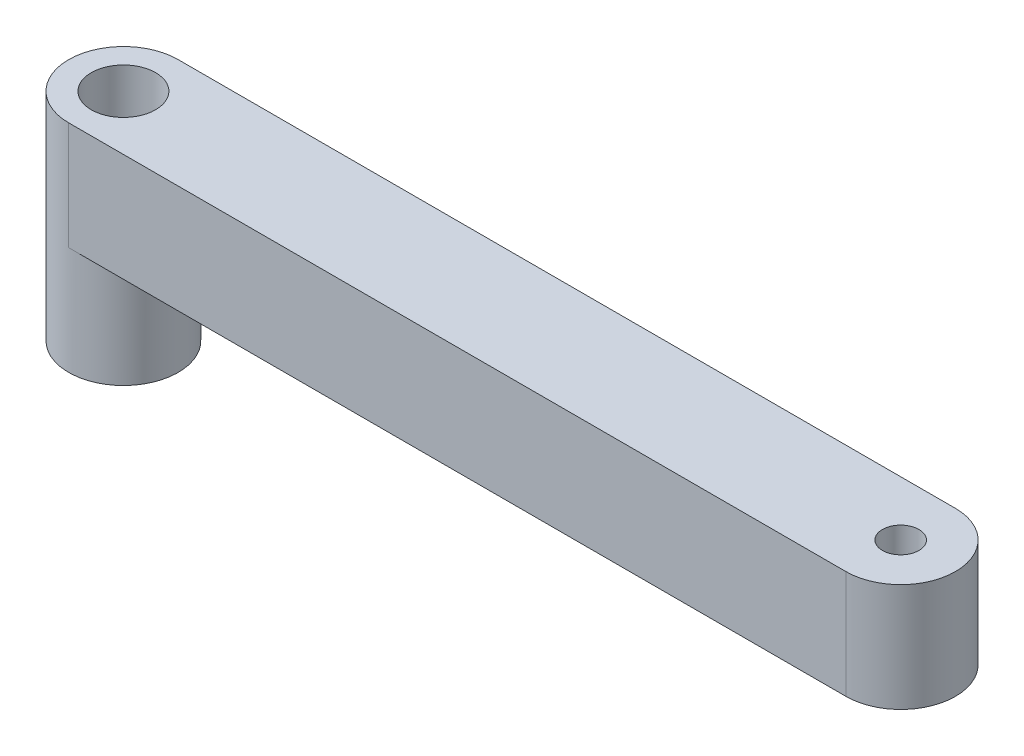
ISO-10303-21;
HEADER;
FILE_DESCRIPTION(('STEP AP214'),'2;1');
FILE_NAME('part.step','',(''),(''),'','','');
FILE_SCHEMA(('AUTOMOTIVE_DESIGN { 1 0 10303 214 1 1 1 1 }'));
ENDSEC;
DATA;
#1=APPLICATION_CONTEXT('core data for automotive mechanical design processes');
#2=APPLICATION_PROTOCOL_DEFINITION('international standard','automotive_design',2000,#1);
#3=PRODUCT_CONTEXT('',#1,'mechanical');
#4=PRODUCT('Part','Part','',(#3));
#5=PRODUCT_RELATED_PRODUCT_CATEGORY('part','',(#4));
#6=PRODUCT_DEFINITION_FORMATION('','',#4);
#7=PRODUCT_DEFINITION_CONTEXT('part definition',#1,'design');
#8=PRODUCT_DEFINITION('design','',#6,#7);
#9=PRODUCT_DEFINITION_SHAPE('','',#8);
#10=(LENGTH_UNIT() NAMED_UNIT(*) SI_UNIT(.MILLI.,.METRE.));
#11=(NAMED_UNIT(*) PLANE_ANGLE_UNIT() SI_UNIT($,.RADIAN.));
#12=(NAMED_UNIT(*) SI_UNIT($,.STERADIAN.) SOLID_ANGLE_UNIT());
#13=UNCERTAINTY_MEASURE_WITH_UNIT(LENGTH_MEASURE(1.E-05),#10,'distance_accuracy_value','');
#14=(GEOMETRIC_REPRESENTATION_CONTEXT(3) GLOBAL_UNCERTAINTY_ASSIGNED_CONTEXT((#13)) GLOBAL_UNIT_ASSIGNED_CONTEXT((#10,
#11,#12)) REPRESENTATION_CONTEXT('',''));
#15=CARTESIAN_POINT('',(0.,0.,0.));
#16=DIRECTION('',(0.,0.,1.));
#17=DIRECTION('',(1.,0.,0.));
#18=AXIS2_PLACEMENT_3D('',#15,#16,#17);
#19=CARTESIAN_POINT('',(-17.2988402061856,0.,-1.94406013745705));
#20=DIRECTION('',(0.,1.,0.));
#21=DIRECTION('',(0.,0.,1.));
#22=AXIS2_PLACEMENT_3D('',#19,#20,#21);
#23=PLANE('',#22);
#24=CARTESIAN_POINT('',(21.0551597938144,0.,-1.94406013745705));
#25=DIRECTION('',(0.,1.,0.));
#26=DIRECTION('',(0.,0.,1.));
#27=AXIS2_PLACEMENT_3D('',#24,#25,#26);
#28=CIRCLE('',#27,0.900000000000011);
#29=CARTESIAN_POINT('',(21.0551597938144,0.,-1.04406013745703));
#30=VERTEX_POINT('',#29);
#31=EDGE_CURVE('E139',#30,#30,#28,.T.);
#32=ORIENTED_EDGE('',*,*,#31,.T.);
#33=EDGE_LOOP('',(#32));
#34=FACE_BOUND('',#33,.T.);
#35=CARTESIAN_POINT('',(-17.2988402061856,0.,-1.94406013745705));
#36=DIRECTION('',(0.,-1.,0.));
#37=DIRECTION('',(0.,0.,-1.));
#38=AXIS2_PLACEMENT_3D('',#35,#36,#37);
#39=CIRCLE('',#38,2.70191408934708);
#40=CARTESIAN_POINT('',(-17.2988402061856,0.,-4.64597422680413));
#41=VERTEX_POINT('',#40);
#42=CARTESIAN_POINT('',(-17.2988402061856,0.,0.757853951890033));
#43=VERTEX_POINT('',#42);
#44=EDGE_CURVE('E94',#41,#43,#39,.T.);
#45=ORIENTED_EDGE('',*,*,#44,.F.);
#46=DIRECTION('',(-1.,0.,0.));
#47=VECTOR('',#46,1.);
#48=CARTESIAN_POINT('',(-17.2988402061856,0.,-4.64597422680412));
#49=LINE('',#48,#47);
#50=CARTESIAN_POINT('',(21.0551597938144,0.,-4.64597422680412));
#51=VERTEX_POINT('',#50);
#52=EDGE_CURVE('E96',#51,#41,#49,.T.);
#53=ORIENTED_EDGE('',*,*,#52,.F.);
#54=CARTESIAN_POINT('',(21.0551597938144,0.,-1.94406013745705));
#55=DIRECTION('',(0.,1.,0.));
#56=DIRECTION('',(0.,0.,1.));
#57=AXIS2_PLACEMENT_3D('',#54,#55,#56);
#58=CIRCLE('',#57,2.70191408934708);
#59=CARTESIAN_POINT('',(21.0551597938144,0.,0.757853951890033));
#60=VERTEX_POINT('',#59);
#61=EDGE_CURVE('E84',#60,#51,#58,.T.);
#62=ORIENTED_EDGE('',*,*,#61,.F.);
#63=DIRECTION('',(1.,0.,0.));
#64=VECTOR('',#63,1.);
#65=CARTESIAN_POINT('',(-17.2988402061856,0.,0.757853951890033));
#66=LINE('',#65,#64);
#67=EDGE_CURVE('E77',#43,#60,#66,.T.);
#68=ORIENTED_EDGE('',*,*,#67,.F.);
#69=EDGE_LOOP('',(#45,#53,#62,#68));
#70=FACE_BOUND('',#69,.T.);
#71=ADVANCED_FACE('F45',(#34,#70),#23,.F.);
#72=CARTESIAN_POINT('',(-17.2988402061856,5.334,-1.94406013745705));
#73=DIRECTION('',(0.,1.,0.));
#74=DIRECTION('',(0.,0.,1.));
#75=AXIS2_PLACEMENT_3D('',#72,#73,#74);
#76=PLANE('',#75);
#77=CARTESIAN_POINT('',(-17.2988402061856,5.334,-1.94406013745705));
#78=DIRECTION('',(0.,1.,0.));
#79=DIRECTION('',(0.,0.,1.));
#80=AXIS2_PLACEMENT_3D('',#77,#78,#79);
#81=CIRCLE('',#80,1.5875);
#82=CARTESIAN_POINT('',(-17.2988402061856,5.334,-0.356560137457047));
#83=VERTEX_POINT('',#82);
#84=EDGE_CURVE('E126',#83,#83,#81,.T.);
#85=ORIENTED_EDGE('',*,*,#84,.F.);
#86=EDGE_LOOP('',(#85));
#87=FACE_BOUND('',#86,.T.);
#88=CARTESIAN_POINT('',(-17.2988402061856,5.334,-1.94406013745705));
#89=DIRECTION('',(0.,1.,0.));
#90=DIRECTION('',(0.,0.,1.));
#91=AXIS2_PLACEMENT_3D('',#88,#89,#90);
#92=CIRCLE('',#91,2.70191408934708);
#93=CARTESIAN_POINT('',(-17.2988402061856,5.334,-4.64597422680412));
#94=VERTEX_POINT('',#93);
#95=CARTESIAN_POINT('',(-17.2988402061856,5.334,0.757853951890033));
#96=VERTEX_POINT('',#95);
#97=EDGE_CURVE('E110',#94,#96,#92,.T.);
#98=ORIENTED_EDGE('',*,*,#97,.T.);
#99=DIRECTION('',(1.,0.,0.));
#100=VECTOR('',#99,1.);
#101=CARTESIAN_POINT('',(-17.2988402061856,5.334,0.757853951890033));
#102=LINE('',#101,#100);
#103=CARTESIAN_POINT('',(21.0551597938144,5.334,0.757853951890033));
#104=VERTEX_POINT('',#103);
#105=EDGE_CURVE('E89',#96,#104,#102,.T.);
#106=ORIENTED_EDGE('',*,*,#105,.T.);
#107=CARTESIAN_POINT('',(21.0551597938144,5.334,-1.94406013745705));
#108=DIRECTION('',(0.,1.,0.));
#109=DIRECTION('',(0.,0.,1.));
#110=AXIS2_PLACEMENT_3D('',#107,#108,#109);
#111=CIRCLE('',#110,2.70191408934708);
#112=CARTESIAN_POINT('',(21.0551597938144,5.334,-4.64597422680412));
#113=VERTEX_POINT('',#112);
#114=EDGE_CURVE('E118',#104,#113,#111,.T.);
#115=ORIENTED_EDGE('',*,*,#114,.T.);
#116=DIRECTION('',(-1.,0.,0.));
#117=VECTOR('',#116,1.);
#118=CARTESIAN_POINT('',(-17.2988402061856,5.334,-4.64597422680412));
#119=LINE('',#118,#117);
#120=EDGE_CURVE('E63',#113,#94,#119,.T.);
#121=ORIENTED_EDGE('',*,*,#120,.T.);
#122=EDGE_LOOP('',(#98,#106,#115,#121));
#123=FACE_BOUND('',#122,.T.);
#124=CARTESIAN_POINT('',(21.0551597938144,5.334,-1.94406013745705));
#125=DIRECTION('',(0.,1.,0.));
#126=DIRECTION('',(0.,0.,1.));
#127=AXIS2_PLACEMENT_3D('',#124,#125,#126);
#128=CIRCLE('',#127,0.900000000000011);
#129=CARTESIAN_POINT('',(21.0551597938144,5.334,-1.04406013745703));
#130=VERTEX_POINT('',#129);
#131=EDGE_CURVE('E138',#130,#130,#128,.T.);
#132=ORIENTED_EDGE('',*,*,#131,.F.);
#133=EDGE_LOOP('',(#132));
#134=FACE_BOUND('',#133,.T.);
#135=ADVANCED_FACE('F167',(#87,#123,#134),#76,.T.);
#136=CARTESIAN_POINT('',(-17.2988402061856,5.334,-1.94406013745705));
#137=DIRECTION('',(0.,-1.,0.));
#138=DIRECTION('',(0.,0.,-1.));
#139=AXIS2_PLACEMENT_3D('',#136,#137,#138);
#140=CYLINDRICAL_SURFACE('',#139,2.70191408934708);
#141=DIRECTION('',(0.,-1.,0.));
#142=VECTOR('',#141,1.);
#143=CARTESIAN_POINT('',(-17.2988402061856,5.334,-4.64597422680412));
#144=LINE('',#143,#142);
#145=EDGE_CURVE('E106',#94,#41,#144,.T.);
#146=ORIENTED_EDGE('',*,*,#145,.T.);
#147=ORIENTED_EDGE('',*,*,#44,.T.);
#148=DIRECTION('',(0.,-1.,0.));
#149=VECTOR('',#148,1.);
#150=CARTESIAN_POINT('',(-17.2988402061856,5.334,0.757853951890033));
#151=LINE('',#150,#149);
#152=EDGE_CURVE('E11',#96,#43,#151,.T.);
#153=ORIENTED_EDGE('',*,*,#152,.F.);
#154=ORIENTED_EDGE('',*,*,#97,.F.);
#155=EDGE_LOOP('',(#146,#147,#153,#154));
#156=FACE_BOUND('',#155,.T.);
#157=CARTESIAN_POINT('',(-17.2988402061856,-5.334,-1.94406013745705));
#158=DIRECTION('',(0.,-1.,0.));
#159=DIRECTION('',(0.,0.,-1.));
#160=AXIS2_PLACEMENT_3D('',#157,#158,#159);
#161=CIRCLE('',#160,2.70191408934708);
#162=CARTESIAN_POINT('',(-17.2988402061856,-5.334,-4.64597422680413));
#163=VERTEX_POINT('',#162);
#164=EDGE_CURVE('E101',#163,#163,#161,.T.);
#165=ORIENTED_EDGE('',*,*,#164,.F.);
#166=EDGE_LOOP('',(#165));
#167=FACE_BOUND('',#166,.T.);
#168=ADVANCED_FACE('F47',(#156,#167),#140,.T.);
#169=CARTESIAN_POINT('',(-17.2988402061856,5.334,0.757853951890033));
#170=DIRECTION('',(0.,0.,-1.));
#171=DIRECTION('',(-1.,0.,0.));
#172=AXIS2_PLACEMENT_3D('',#169,#170,#171);
#173=PLANE('',#172);
#174=ORIENTED_EDGE('',*,*,#67,.T.);
#175=DIRECTION('',(0.,-1.,0.));
#176=VECTOR('',#175,1.);
#177=CARTESIAN_POINT('',(21.0551597938144,5.334,0.757853951890033));
#178=LINE('',#177,#176);
#179=EDGE_CURVE('E55',#104,#60,#178,.T.);
#180=ORIENTED_EDGE('',*,*,#179,.F.);
#181=ORIENTED_EDGE('',*,*,#105,.F.);
#182=ORIENTED_EDGE('',*,*,#152,.T.);
#183=EDGE_LOOP('',(#174,#180,#181,#182));
#184=FACE_BOUND('',#183,.T.);
#185=ADVANCED_FACE('F181',(#184),#173,.F.);
#186=CARTESIAN_POINT('',(21.0551597938144,5.334,-1.94406013745705));
#187=DIRECTION('',(0.,-1.,0.));
#188=DIRECTION('',(0.,0.,-1.));
#189=AXIS2_PLACEMENT_3D('',#186,#187,#188);
#190=CYLINDRICAL_SURFACE('',#189,2.70191408934708);
#191=ORIENTED_EDGE('',*,*,#61,.T.);
#192=DIRECTION('',(0.,-1.,0.));
#193=VECTOR('',#192,1.);
#194=CARTESIAN_POINT('',(21.0551597938144,5.334,-4.64597422680412));
#195=LINE('',#194,#193);
#196=EDGE_CURVE('E108',#113,#51,#195,.T.);
#197=ORIENTED_EDGE('',*,*,#196,.F.);
#198=ORIENTED_EDGE('',*,*,#114,.F.);
#199=ORIENTED_EDGE('',*,*,#179,.T.);
#200=EDGE_LOOP('',(#191,#197,#198,#199));
#201=FACE_BOUND('',#200,.T.);
#202=ADVANCED_FACE('F123',(#201),#190,.T.);
#203=CARTESIAN_POINT('',(-17.2988402061856,5.334,-4.64597422680412));
#204=DIRECTION('',(0.,0.,1.));
#205=DIRECTION('',(1.,0.,0.));
#206=AXIS2_PLACEMENT_3D('',#203,#204,#205);
#207=PLANE('',#206);
#208=ORIENTED_EDGE('',*,*,#52,.T.);
#209=ORIENTED_EDGE('',*,*,#145,.F.);
#210=ORIENTED_EDGE('',*,*,#120,.F.);
#211=ORIENTED_EDGE('',*,*,#196,.T.);
#212=EDGE_LOOP('',(#208,#209,#210,#211));
#213=FACE_BOUND('',#212,.T.);
#214=ADVANCED_FACE('F105',(#213),#207,.F.);
#215=CARTESIAN_POINT('',(-17.2988402061856,5.334,-1.94406013745705));
#216=DIRECTION('',(0.,-1.,0.));
#217=DIRECTION('',(0.,0.,-1.));
#218=AXIS2_PLACEMENT_3D('',#215,#216,#217);
#219=CYLINDRICAL_SURFACE('',#218,1.5875);
#220=ORIENTED_EDGE('',*,*,#84,.T.);
#221=EDGE_LOOP('',(#220));
#222=FACE_BOUND('',#221,.T.);
#223=CARTESIAN_POINT('',(-17.2988402061856,-5.334,-1.94406013745705));
#224=DIRECTION('',(0.,-1.,0.));
#225=DIRECTION('',(0.,0.,-1.));
#226=AXIS2_PLACEMENT_3D('',#223,#224,#225);
#227=CIRCLE('',#226,1.5875);
#228=CARTESIAN_POINT('',(-17.2988402061856,-5.334,-3.53156013745704));
#229=VERTEX_POINT('',#228);
#230=EDGE_CURVE('E102',#229,#229,#227,.T.);
#231=ORIENTED_EDGE('',*,*,#230,.T.);
#232=EDGE_LOOP('',(#231));
#233=FACE_BOUND('',#232,.T.);
#234=ADVANCED_FACE('F153',(#222,#233),#219,.F.);
#235=CARTESIAN_POINT('',(21.0551597938144,5.334,-1.94406013745705));
#236=DIRECTION('',(0.,-1.,0.));
#237=DIRECTION('',(0.,0.,-1.));
#238=AXIS2_PLACEMENT_3D('',#235,#236,#237);
#239=CYLINDRICAL_SURFACE('',#238,0.900000000000011);
#240=ORIENTED_EDGE('',*,*,#131,.T.);
#241=EDGE_LOOP('',(#240));
#242=FACE_BOUND('',#241,.T.);
#243=ORIENTED_EDGE('',*,*,#31,.F.);
#244=EDGE_LOOP('',(#243));
#245=FACE_BOUND('',#244,.T.);
#246=ADVANCED_FACE('F157',(#242,#245),#239,.F.);
#247=CARTESIAN_POINT('',(-17.2988402061856,-5.334,-1.94406013745705));
#248=DIRECTION('',(0.,-1.,0.));
#249=DIRECTION('',(0.,0.,-1.));
#250=AXIS2_PLACEMENT_3D('',#247,#248,#249);
#251=PLANE('',#250);
#252=ORIENTED_EDGE('',*,*,#164,.T.);
#253=EDGE_LOOP('',(#252));
#254=FACE_BOUND('',#253,.T.);
#255=ORIENTED_EDGE('',*,*,#230,.F.);
#256=EDGE_LOOP('',(#255));
#257=FACE_BOUND('',#256,.T.);
#258=ADVANCED_FACE('F155',(#254,#257),#251,.T.);
#259=CLOSED_SHELL('',(#71,#135,#168,#185,#202,#214,#234,#246,#258));
#260=MANIFOLD_SOLID_BREP('B2',#259);
#261=ADVANCED_BREP_SHAPE_REPRESENTATION('',(#18,#260),#14);
#262=SHAPE_DEFINITION_REPRESENTATION(#9,#261);
ENDSEC;
END-ISO-10303-21;
